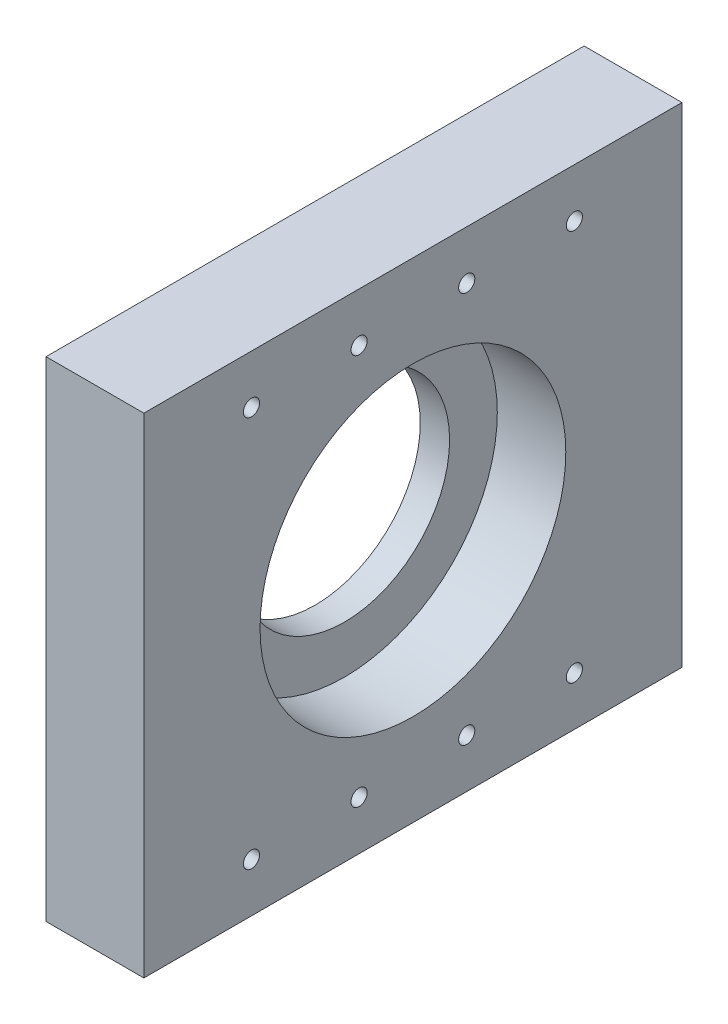
ISO-10303-21;
HEADER;
FILE_DESCRIPTION(('STEP AP214'),'2;1');
FILE_NAME('part.step','',(''),(''),'','','');
FILE_SCHEMA(('AUTOMOTIVE_DESIGN { 1 0 10303 214 1 1 1 1 }'));
ENDSEC;
DATA;
#1=APPLICATION_CONTEXT('core data for automotive mechanical design processes');
#2=APPLICATION_PROTOCOL_DEFINITION('international standard','automotive_design',2000,#1);
#3=PRODUCT_CONTEXT('',#1,'mechanical');
#4=PRODUCT('Part','Part','',(#3));
#5=PRODUCT_RELATED_PRODUCT_CATEGORY('part','',(#4));
#6=PRODUCT_DEFINITION_FORMATION('','',#4);
#7=PRODUCT_DEFINITION_CONTEXT('part definition',#1,'design');
#8=PRODUCT_DEFINITION('design','',#6,#7);
#9=PRODUCT_DEFINITION_SHAPE('','',#8);
#10=(LENGTH_UNIT() NAMED_UNIT(*) SI_UNIT(.MILLI.,.METRE.));
#11=(NAMED_UNIT(*) PLANE_ANGLE_UNIT() SI_UNIT($,.RADIAN.));
#12=(NAMED_UNIT(*) SI_UNIT($,.STERADIAN.) SOLID_ANGLE_UNIT());
#13=UNCERTAINTY_MEASURE_WITH_UNIT(LENGTH_MEASURE(1.E-05),#10,'distance_accuracy_value','');
#14=(GEOMETRIC_REPRESENTATION_CONTEXT(3) GLOBAL_UNCERTAINTY_ASSIGNED_CONTEXT((#13)) GLOBAL_UNIT_ASSIGNED_CONTEXT((#10,
#11,#12)) REPRESENTATION_CONTEXT('',''));
#15=CARTESIAN_POINT('',(0.,0.,0.));
#16=DIRECTION('',(0.,0.,1.));
#17=DIRECTION('',(1.,0.,0.));
#18=AXIS2_PLACEMENT_3D('',#15,#16,#17);
#19=CARTESIAN_POINT('',(20.,50.,-55.));
#20=DIRECTION('',(0.,0.,1.));
#21=DIRECTION('',(0.,-1.,0.));
#22=AXIS2_PLACEMENT_3D('',#19,#20,#21);
#23=PLANE('',#22);
#24=DIRECTION('',(0.,1.,0.));
#25=VECTOR('',#24,1.);
#26=CARTESIAN_POINT('',(0.,50.,-55.));
#27=LINE('',#26,#25);
#28=CARTESIAN_POINT('',(0.,-50.,-55.));
#29=VERTEX_POINT('',#28);
#30=CARTESIAN_POINT('',(0.,50.,-55.));
#31=VERTEX_POINT('',#30);
#32=EDGE_CURVE('E106',#29,#31,#27,.T.);
#33=ORIENTED_EDGE('',*,*,#32,.T.);
#34=DIRECTION('',(-1.,0.,0.));
#35=VECTOR('',#34,1.);
#36=CARTESIAN_POINT('',(20.,50.,-55.));
#37=LINE('',#36,#35);
#38=CARTESIAN_POINT('',(20.,50.,-55.));
#39=VERTEX_POINT('',#38);
#40=EDGE_CURVE('E11',#39,#31,#37,.T.);
#41=ORIENTED_EDGE('',*,*,#40,.F.);
#42=DIRECTION('',(0.,1.,0.));
#43=VECTOR('',#42,1.);
#44=CARTESIAN_POINT('',(20.,50.,-55.));
#45=LINE('',#44,#43);
#46=CARTESIAN_POINT('',(20.,-50.,-55.));
#47=VERTEX_POINT('',#46);
#48=EDGE_CURVE('E93',#47,#39,#45,.T.);
#49=ORIENTED_EDGE('',*,*,#48,.F.);
#50=DIRECTION('',(-1.,0.,0.));
#51=VECTOR('',#50,1.);
#52=CARTESIAN_POINT('',(20.,-50.,-55.));
#53=LINE('',#52,#51);
#54=EDGE_CURVE('E102',#47,#29,#53,.T.);
#55=ORIENTED_EDGE('',*,*,#54,.T.);
#56=EDGE_LOOP('',(#33,#41,#49,#55));
#57=FACE_BOUND('',#56,.T.);
#58=ADVANCED_FACE('F41',(#57),#23,.F.);
#59=CARTESIAN_POINT('',(20.,50.,55.));
#60=DIRECTION('',(0.,-1.,0.));
#61=DIRECTION('',(0.,0.,-1.));
#62=AXIS2_PLACEMENT_3D('',#59,#60,#61);
#63=PLANE('',#62);
#64=DIRECTION('',(0.,0.,1.));
#65=VECTOR('',#64,1.);
#66=CARTESIAN_POINT('',(0.,50.,55.));
#67=LINE('',#66,#65);
#68=CARTESIAN_POINT('',(0.,50.,55.));
#69=VERTEX_POINT('',#68);
#70=EDGE_CURVE('E97',#31,#69,#67,.T.);
#71=ORIENTED_EDGE('',*,*,#70,.T.);
#72=DIRECTION('',(-1.,0.,0.));
#73=VECTOR('',#72,1.);
#74=CARTESIAN_POINT('',(20.,50.,55.));
#75=LINE('',#74,#73);
#76=CARTESIAN_POINT('',(20.,50.,55.));
#77=VERTEX_POINT('',#76);
#78=EDGE_CURVE('E50',#77,#69,#75,.T.);
#79=ORIENTED_EDGE('',*,*,#78,.F.);
#80=DIRECTION('',(0.,0.,1.));
#81=VECTOR('',#80,1.);
#82=CARTESIAN_POINT('',(20.,50.,55.));
#83=LINE('',#82,#81);
#84=EDGE_CURVE('E88',#39,#77,#83,.T.);
#85=ORIENTED_EDGE('',*,*,#84,.F.);
#86=ORIENTED_EDGE('',*,*,#40,.T.);
#87=EDGE_LOOP('',(#71,#79,#85,#86));
#88=FACE_BOUND('',#87,.T.);
#89=ADVANCED_FACE('F96',(#88),#63,.F.);
#90=CARTESIAN_POINT('',(20.,50.,55.));
#91=DIRECTION('',(0.,0.,-1.));
#92=DIRECTION('',(0.,1.,0.));
#93=AXIS2_PLACEMENT_3D('',#90,#91,#92);
#94=PLANE('',#93);
#95=DIRECTION('',(0.,-1.,0.));
#96=VECTOR('',#95,1.);
#97=CARTESIAN_POINT('',(0.,50.,55.));
#98=LINE('',#97,#96);
#99=CARTESIAN_POINT('',(0.,-50.,55.));
#100=VERTEX_POINT('',#99);
#101=EDGE_CURVE('E75',#69,#100,#98,.T.);
#102=ORIENTED_EDGE('',*,*,#101,.T.);
#103=DIRECTION('',(-1.,0.,0.));
#104=VECTOR('',#103,1.);
#105=CARTESIAN_POINT('',(20.,-50.,55.));
#106=LINE('',#105,#104);
#107=CARTESIAN_POINT('',(20.,-50.,55.));
#108=VERTEX_POINT('',#107);
#109=EDGE_CURVE('E98',#108,#100,#106,.T.);
#110=ORIENTED_EDGE('',*,*,#109,.F.);
#111=DIRECTION('',(0.,-1.,0.));
#112=VECTOR('',#111,1.);
#113=CARTESIAN_POINT('',(20.,50.,55.));
#114=LINE('',#113,#112);
#115=EDGE_CURVE('E91',#77,#108,#114,.T.);
#116=ORIENTED_EDGE('',*,*,#115,.F.);
#117=ORIENTED_EDGE('',*,*,#78,.T.);
#118=EDGE_LOOP('',(#102,#110,#116,#117));
#119=FACE_BOUND('',#118,.T.);
#120=ADVANCED_FACE('F100',(#119),#94,.F.);
#121=CARTESIAN_POINT('',(20.,-50.,55.));
#122=DIRECTION('',(0.,1.,0.));
#123=DIRECTION('',(0.,0.,1.));
#124=AXIS2_PLACEMENT_3D('',#121,#122,#123);
#125=PLANE('',#124);
#126=DIRECTION('',(0.,0.,-1.));
#127=VECTOR('',#126,1.);
#128=CARTESIAN_POINT('',(0.,-50.,55.));
#129=LINE('',#128,#127);
#130=EDGE_CURVE('E81',#100,#29,#129,.T.);
#131=ORIENTED_EDGE('',*,*,#130,.T.);
#132=ORIENTED_EDGE('',*,*,#54,.F.);
#133=DIRECTION('',(0.,0.,-1.));
#134=VECTOR('',#133,1.);
#135=CARTESIAN_POINT('',(20.,-50.,55.));
#136=LINE('',#135,#134);
#137=EDGE_CURVE('E58',#108,#47,#136,.T.);
#138=ORIENTED_EDGE('',*,*,#137,.F.);
#139=ORIENTED_EDGE('',*,*,#109,.T.);
#140=EDGE_LOOP('',(#131,#132,#138,#139));
#141=FACE_BOUND('',#140,.T.);
#142=ADVANCED_FACE('F114',(#141),#125,.F.);
#143=CARTESIAN_POINT('',(20.,0.,0.));
#144=DIRECTION('',(1.,0.,0.));
#145=DIRECTION('',(0.,0.,-1.));
#146=AXIS2_PLACEMENT_3D('',#143,#144,#145);
#147=PLANE('',#146);
#148=CARTESIAN_POINT('',(20.,-40.,11.));
#149=DIRECTION('',(1.,0.,0.));
#150=DIRECTION('',(0.,0.,1.));
#151=AXIS2_PLACEMENT_3D('',#148,#149,#150);
#152=CIRCLE('',#151,1.65);
#153=CARTESIAN_POINT('',(20.,-40.,12.65));
#154=VERTEX_POINT('',#153);
#155=EDGE_CURVE('E150',#154,#154,#152,.T.);
#156=ORIENTED_EDGE('',*,*,#155,.F.);
#157=EDGE_LOOP('',(#156));
#158=FACE_BOUND('',#157,.T.);
#159=CARTESIAN_POINT('',(20.,40.,33.));
#160=DIRECTION('',(1.,0.,0.));
#161=DIRECTION('',(0.,0.,-1.));
#162=AXIS2_PLACEMENT_3D('',#159,#160,#161);
#163=CIRCLE('',#162,1.65);
#164=CARTESIAN_POINT('',(20.,40.,31.35));
#165=VERTEX_POINT('',#164);
#166=EDGE_CURVE('E139',#165,#165,#163,.T.);
#167=ORIENTED_EDGE('',*,*,#166,.F.);
#168=EDGE_LOOP('',(#167));
#169=FACE_BOUND('',#168,.T.);
#170=CARTESIAN_POINT('',(20.,40.,11.));
#171=DIRECTION('',(1.,0.,0.));
#172=DIRECTION('',(0.,0.,-1.));
#173=AXIS2_PLACEMENT_3D('',#170,#171,#172);
#174=CIRCLE('',#173,1.65);
#175=CARTESIAN_POINT('',(20.,40.,9.34999999999997));
#176=VERTEX_POINT('',#175);
#177=EDGE_CURVE('E138',#176,#176,#174,.T.);
#178=ORIENTED_EDGE('',*,*,#177,.F.);
#179=EDGE_LOOP('',(#178));
#180=FACE_BOUND('',#179,.T.);
#181=CARTESIAN_POINT('',(20.,40.,-11.));
#182=DIRECTION('',(1.,0.,0.));
#183=DIRECTION('',(0.,0.,-1.));
#184=AXIS2_PLACEMENT_3D('',#181,#182,#183);
#185=CIRCLE('',#184,1.65);
#186=CARTESIAN_POINT('',(20.,40.,-12.65));
#187=VERTEX_POINT('',#186);
#188=EDGE_CURVE('E132',#187,#187,#185,.T.);
#189=ORIENTED_EDGE('',*,*,#188,.F.);
#190=EDGE_LOOP('',(#189));
#191=FACE_BOUND('',#190,.T.);
#192=CARTESIAN_POINT('',(20.,-40.,-11.));
#193=DIRECTION('',(1.,0.,0.));
#194=DIRECTION('',(0.,0.,1.));
#195=AXIS2_PLACEMENT_3D('',#192,#193,#194);
#196=CIRCLE('',#195,1.65);
#197=CARTESIAN_POINT('',(20.,-40.,-9.35000000000002));
#198=VERTEX_POINT('',#197);
#199=EDGE_CURVE('E151',#198,#198,#196,.T.);
#200=ORIENTED_EDGE('',*,*,#199,.F.);
#201=EDGE_LOOP('',(#200));
#202=FACE_BOUND('',#201,.T.);
#203=CARTESIAN_POINT('',(20.,-40.,-33.));
#204=DIRECTION('',(1.,0.,0.));
#205=DIRECTION('',(0.,0.,1.));
#206=AXIS2_PLACEMENT_3D('',#203,#204,#205);
#207=CIRCLE('',#206,1.65);
#208=CARTESIAN_POINT('',(20.,-40.,-31.35));
#209=VERTEX_POINT('',#208);
#210=EDGE_CURVE('E168',#209,#209,#207,.T.);
#211=ORIENTED_EDGE('',*,*,#210,.F.);
#212=EDGE_LOOP('',(#211));
#213=FACE_BOUND('',#212,.T.);
#214=CARTESIAN_POINT('',(20.,-40.,33.));
#215=DIRECTION('',(1.,0.,0.));
#216=DIRECTION('',(0.,0.,1.));
#217=AXIS2_PLACEMENT_3D('',#214,#215,#216);
#218=CIRCLE('',#217,1.65);
#219=CARTESIAN_POINT('',(20.,-40.,34.65));
#220=VERTEX_POINT('',#219);
#221=EDGE_CURVE('E162',#220,#220,#218,.T.);
#222=ORIENTED_EDGE('',*,*,#221,.F.);
#223=EDGE_LOOP('',(#222));
#224=FACE_BOUND('',#223,.T.);
#225=CARTESIAN_POINT('',(20.,40.,-33.));
#226=DIRECTION('',(1.,0.,0.));
#227=DIRECTION('',(0.,0.,-1.));
#228=AXIS2_PLACEMENT_3D('',#225,#226,#227);
#229=CIRCLE('',#228,1.65);
#230=CARTESIAN_POINT('',(20.,40.,-34.65));
#231=VERTEX_POINT('',#230);
#232=EDGE_CURVE('E129',#231,#231,#229,.T.);
#233=ORIENTED_EDGE('',*,*,#232,.F.);
#234=EDGE_LOOP('',(#233));
#235=FACE_BOUND('',#234,.T.);
#236=CARTESIAN_POINT('',(20.,0.,0.));
#237=DIRECTION('',(1.,0.,0.));
#238=DIRECTION('',(0.,0.,-1.));
#239=AXIS2_PLACEMENT_3D('',#236,#237,#238);
#240=CIRCLE('',#239,31.25);
#241=CARTESIAN_POINT('',(20.,0.,-31.25));
#242=VERTEX_POINT('',#241);
#243=EDGE_CURVE('E120',#242,#242,#240,.T.);
#244=ORIENTED_EDGE('',*,*,#243,.F.);
#245=EDGE_LOOP('',(#244));
#246=FACE_BOUND('',#245,.T.);
#247=ORIENTED_EDGE('',*,*,#48,.T.);
#248=ORIENTED_EDGE('',*,*,#84,.T.);
#249=ORIENTED_EDGE('',*,*,#115,.T.);
#250=ORIENTED_EDGE('',*,*,#137,.T.);
#251=EDGE_LOOP('',(#247,#248,#249,#250));
#252=FACE_BOUND('',#251,.T.);
#253=ADVANCED_FACE('F89',(#158,#169,#180,#191,#202,#213,#224,#235,#246,#252),#147,.T.);
#254=CARTESIAN_POINT('',(0.,0.,0.));
#255=DIRECTION('',(1.,0.,0.));
#256=DIRECTION('',(0.,0.,-1.));
#257=AXIS2_PLACEMENT_3D('',#254,#255,#256);
#258=PLANE('',#257);
#259=CARTESIAN_POINT('',(0.,-40.,11.));
#260=DIRECTION('',(1.,0.,0.));
#261=DIRECTION('',(0.,0.,1.));
#262=AXIS2_PLACEMENT_3D('',#259,#260,#261);
#263=CIRCLE('',#262,1.65);
#264=CARTESIAN_POINT('',(0.,-40.,12.65));
#265=VERTEX_POINT('',#264);
#266=EDGE_CURVE('E147',#265,#265,#263,.T.);
#267=ORIENTED_EDGE('',*,*,#266,.T.);
#268=EDGE_LOOP('',(#267));
#269=FACE_BOUND('',#268,.T.);
#270=CARTESIAN_POINT('',(0.,40.,33.));
#271=DIRECTION('',(1.,0.,0.));
#272=DIRECTION('',(0.,0.,-1.));
#273=AXIS2_PLACEMENT_3D('',#270,#271,#272);
#274=CIRCLE('',#273,1.65);
#275=CARTESIAN_POINT('',(0.,40.,31.35));
#276=VERTEX_POINT('',#275);
#277=EDGE_CURVE('E154',#276,#276,#274,.T.);
#278=ORIENTED_EDGE('',*,*,#277,.T.);
#279=EDGE_LOOP('',(#278));
#280=FACE_BOUND('',#279,.T.);
#281=CARTESIAN_POINT('',(0.,40.,11.));
#282=DIRECTION('',(1.,0.,0.));
#283=DIRECTION('',(0.,0.,-1.));
#284=AXIS2_PLACEMENT_3D('',#281,#282,#283);
#285=CIRCLE('',#284,1.65);
#286=CARTESIAN_POINT('',(0.,40.,9.34999999999997));
#287=VERTEX_POINT('',#286);
#288=EDGE_CURVE('E135',#287,#287,#285,.T.);
#289=ORIENTED_EDGE('',*,*,#288,.T.);
#290=EDGE_LOOP('',(#289));
#291=FACE_BOUND('',#290,.T.);
#292=CARTESIAN_POINT('',(0.,40.,-11.));
#293=DIRECTION('',(1.,0.,0.));
#294=DIRECTION('',(0.,0.,-1.));
#295=AXIS2_PLACEMENT_3D('',#292,#293,#294);
#296=CIRCLE('',#295,1.65);
#297=CARTESIAN_POINT('',(0.,40.,-12.65));
#298=VERTEX_POINT('',#297);
#299=EDGE_CURVE('E142',#298,#298,#296,.T.);
#300=ORIENTED_EDGE('',*,*,#299,.T.);
#301=EDGE_LOOP('',(#300));
#302=FACE_BOUND('',#301,.T.);
#303=CARTESIAN_POINT('',(0.,-40.,-11.));
#304=DIRECTION('',(1.,0.,0.));
#305=DIRECTION('',(0.,0.,1.));
#306=AXIS2_PLACEMENT_3D('',#303,#304,#305);
#307=CIRCLE('',#306,1.65);
#308=CARTESIAN_POINT('',(0.,-40.,-9.35000000000002));
#309=VERTEX_POINT('',#308);
#310=EDGE_CURVE('E171',#309,#309,#307,.T.);
#311=ORIENTED_EDGE('',*,*,#310,.T.);
#312=EDGE_LOOP('',(#311));
#313=FACE_BOUND('',#312,.T.);
#314=CARTESIAN_POINT('',(0.,-40.,-33.));
#315=DIRECTION('',(1.,0.,0.));
#316=DIRECTION('',(0.,0.,1.));
#317=AXIS2_PLACEMENT_3D('',#314,#315,#316);
#318=CIRCLE('',#317,1.65);
#319=CARTESIAN_POINT('',(0.,-40.,-31.35));
#320=VERTEX_POINT('',#319);
#321=EDGE_CURVE('E165',#320,#320,#318,.T.);
#322=ORIENTED_EDGE('',*,*,#321,.T.);
#323=EDGE_LOOP('',(#322));
#324=FACE_BOUND('',#323,.T.);
#325=CARTESIAN_POINT('',(0.,-40.,33.));
#326=DIRECTION('',(1.,0.,0.));
#327=DIRECTION('',(0.,0.,1.));
#328=AXIS2_PLACEMENT_3D('',#325,#326,#327);
#329=CIRCLE('',#328,1.65);
#330=CARTESIAN_POINT('',(0.,-40.,34.65));
#331=VERTEX_POINT('',#330);
#332=EDGE_CURVE('E159',#331,#331,#329,.T.);
#333=ORIENTED_EDGE('',*,*,#332,.T.);
#334=EDGE_LOOP('',(#333));
#335=FACE_BOUND('',#334,.T.);
#336=CARTESIAN_POINT('',(0.,40.,-33.));
#337=DIRECTION('',(1.,0.,0.));
#338=DIRECTION('',(0.,0.,-1.));
#339=AXIS2_PLACEMENT_3D('',#336,#337,#338);
#340=CIRCLE('',#339,1.65);
#341=CARTESIAN_POINT('',(0.,40.,-34.65));
#342=VERTEX_POINT('',#341);
#343=EDGE_CURVE('E128',#342,#342,#340,.T.);
#344=ORIENTED_EDGE('',*,*,#343,.T.);
#345=EDGE_LOOP('',(#344));
#346=FACE_BOUND('',#345,.T.);
#347=CARTESIAN_POINT('',(0.,0.,0.));
#348=DIRECTION('',(1.,0.,0.));
#349=DIRECTION('',(0.,0.,-1.));
#350=AXIS2_PLACEMENT_3D('',#347,#348,#349);
#351=CIRCLE('',#350,21.5);
#352=CARTESIAN_POINT('',(0.,0.,-21.5));
#353=VERTEX_POINT('',#352);
#354=EDGE_CURVE('E44',#353,#353,#351,.T.);
#355=ORIENTED_EDGE('',*,*,#354,.T.);
#356=EDGE_LOOP('',(#355));
#357=FACE_BOUND('',#356,.T.);
#358=ORIENTED_EDGE('',*,*,#32,.F.);
#359=ORIENTED_EDGE('',*,*,#130,.F.);
#360=ORIENTED_EDGE('',*,*,#101,.F.);
#361=ORIENTED_EDGE('',*,*,#70,.F.);
#362=EDGE_LOOP('',(#358,#359,#360,#361));
#363=FACE_BOUND('',#362,.T.);
#364=ADVANCED_FACE('F117',(#269,#280,#291,#302,#313,#324,#335,#346,#357,#363),#258,.F.);
#365=CARTESIAN_POINT('',(6.,0.,0.));
#366=DIRECTION('',(1.,0.,0.));
#367=DIRECTION('',(0.,0.,-1.));
#368=AXIS2_PLACEMENT_3D('',#365,#366,#367);
#369=CYLINDRICAL_SURFACE('',#368,31.25);
#370=CARTESIAN_POINT('',(6.,0.,0.));
#371=DIRECTION('',(1.,0.,0.));
#372=DIRECTION('',(0.,0.,-1.));
#373=AXIS2_PLACEMENT_3D('',#370,#371,#372);
#374=CIRCLE('',#373,31.25);
#375=CARTESIAN_POINT('',(6.,0.,-31.25));
#376=VERTEX_POINT('',#375);
#377=EDGE_CURVE('E109',#376,#376,#374,.T.);
#378=ORIENTED_EDGE('',*,*,#377,.F.);
#379=EDGE_LOOP('',(#378));
#380=FACE_BOUND('',#379,.T.);
#381=ORIENTED_EDGE('',*,*,#243,.T.);
#382=EDGE_LOOP('',(#381));
#383=FACE_BOUND('',#382,.T.);
#384=ADVANCED_FACE('F191',(#380,#383),#369,.F.);
#385=CARTESIAN_POINT('',(6.,0.,0.));
#386=DIRECTION('',(1.,0.,0.));
#387=DIRECTION('',(0.,0.,-1.));
#388=AXIS2_PLACEMENT_3D('',#385,#386,#387);
#389=PLANE('',#388);
#390=CARTESIAN_POINT('',(6.,0.,0.));
#391=DIRECTION('',(1.,0.,0.));
#392=DIRECTION('',(0.,0.,-1.));
#393=AXIS2_PLACEMENT_3D('',#390,#391,#392);
#394=CIRCLE('',#393,21.5);
#395=CARTESIAN_POINT('',(6.,0.,-21.5));
#396=VERTEX_POINT('',#395);
#397=EDGE_CURVE('E125',#396,#396,#394,.T.);
#398=ORIENTED_EDGE('',*,*,#397,.F.);
#399=EDGE_LOOP('',(#398));
#400=FACE_BOUND('',#399,.T.);
#401=ORIENTED_EDGE('',*,*,#377,.T.);
#402=EDGE_LOOP('',(#401));
#403=FACE_BOUND('',#402,.T.);
#404=ADVANCED_FACE('F193',(#400,#403),#389,.T.);
#405=CARTESIAN_POINT('',(-8.,0.,0.));
#406=DIRECTION('',(1.,0.,0.));
#407=DIRECTION('',(0.,0.,-1.));
#408=AXIS2_PLACEMENT_3D('',#405,#406,#407);
#409=CYLINDRICAL_SURFACE('',#408,21.5);
#410=ORIENTED_EDGE('',*,*,#397,.T.);
#411=EDGE_LOOP('',(#410));
#412=FACE_BOUND('',#411,.T.);
#413=ORIENTED_EDGE('',*,*,#354,.F.);
#414=EDGE_LOOP('',(#413));
#415=FACE_BOUND('',#414,.T.);
#416=ADVANCED_FACE('F200',(#412,#415),#409,.F.);
#417=CARTESIAN_POINT('',(0.,40.,-33.));
#418=DIRECTION('',(1.,0.,0.));
#419=DIRECTION('',(0.,0.,-1.));
#420=AXIS2_PLACEMENT_3D('',#417,#418,#419);
#421=CYLINDRICAL_SURFACE('',#420,1.65);
#422=ORIENTED_EDGE('',*,*,#343,.F.);
#423=EDGE_LOOP('',(#422));
#424=FACE_BOUND('',#423,.T.);
#425=ORIENTED_EDGE('',*,*,#232,.T.);
#426=EDGE_LOOP('',(#425));
#427=FACE_BOUND('',#426,.T.);
#428=ADVANCED_FACE('F260',(#424,#427),#421,.F.);
#429=CARTESIAN_POINT('',(0.,-40.,33.));
#430=DIRECTION('',(1.,0.,0.));
#431=DIRECTION('',(0.,0.,-1.));
#432=AXIS2_PLACEMENT_3D('',#429,#430,#431);
#433=CYLINDRICAL_SURFACE('',#432,1.65);
#434=ORIENTED_EDGE('',*,*,#332,.F.);
#435=EDGE_LOOP('',(#434));
#436=FACE_BOUND('',#435,.T.);
#437=ORIENTED_EDGE('',*,*,#221,.T.);
#438=EDGE_LOOP('',(#437));
#439=FACE_BOUND('',#438,.T.);
#440=ADVANCED_FACE('F269',(#436,#439),#433,.F.);
#441=CARTESIAN_POINT('',(0.,-40.,-33.));
#442=DIRECTION('',(1.,0.,0.));
#443=DIRECTION('',(0.,0.,-1.));
#444=AXIS2_PLACEMENT_3D('',#441,#442,#443);
#445=CYLINDRICAL_SURFACE('',#444,1.65);
#446=ORIENTED_EDGE('',*,*,#321,.F.);
#447=EDGE_LOOP('',(#446));
#448=FACE_BOUND('',#447,.T.);
#449=ORIENTED_EDGE('',*,*,#210,.T.);
#450=EDGE_LOOP('',(#449));
#451=FACE_BOUND('',#450,.T.);
#452=ADVANCED_FACE('F278',(#448,#451),#445,.F.);
#453=CARTESIAN_POINT('',(0.,-40.,-11.));
#454=DIRECTION('',(1.,0.,0.));
#455=DIRECTION('',(0.,0.,-1.));
#456=AXIS2_PLACEMENT_3D('',#453,#454,#455);
#457=CYLINDRICAL_SURFACE('',#456,1.65);
#458=ORIENTED_EDGE('',*,*,#310,.F.);
#459=EDGE_LOOP('',(#458));
#460=FACE_BOUND('',#459,.T.);
#461=ORIENTED_EDGE('',*,*,#199,.T.);
#462=EDGE_LOOP('',(#461));
#463=FACE_BOUND('',#462,.T.);
#464=ADVANCED_FACE('F177',(#460,#463),#457,.F.);
#465=CARTESIAN_POINT('',(0.,40.,-11.));
#466=DIRECTION('',(1.,0.,0.));
#467=DIRECTION('',(0.,0.,-1.));
#468=AXIS2_PLACEMENT_3D('',#465,#466,#467);
#469=CYLINDRICAL_SURFACE('',#468,1.65);
#470=ORIENTED_EDGE('',*,*,#299,.F.);
#471=EDGE_LOOP('',(#470));
#472=FACE_BOUND('',#471,.T.);
#473=ORIENTED_EDGE('',*,*,#188,.T.);
#474=EDGE_LOOP('',(#473));
#475=FACE_BOUND('',#474,.T.);
#476=ADVANCED_FACE('F295',(#472,#475),#469,.F.);
#477=CARTESIAN_POINT('',(0.,40.,11.));
#478=DIRECTION('',(1.,0.,0.));
#479=DIRECTION('',(0.,0.,-1.));
#480=AXIS2_PLACEMENT_3D('',#477,#478,#479);
#481=CYLINDRICAL_SURFACE('',#480,1.65);
#482=ORIENTED_EDGE('',*,*,#288,.F.);
#483=EDGE_LOOP('',(#482));
#484=FACE_BOUND('',#483,.T.);
#485=ORIENTED_EDGE('',*,*,#177,.T.);
#486=EDGE_LOOP('',(#485));
#487=FACE_BOUND('',#486,.T.);
#488=ADVANCED_FACE('F304',(#484,#487),#481,.F.);
#489=CARTESIAN_POINT('',(0.,40.,33.));
#490=DIRECTION('',(1.,0.,0.));
#491=DIRECTION('',(0.,0.,-1.));
#492=AXIS2_PLACEMENT_3D('',#489,#490,#491);
#493=CYLINDRICAL_SURFACE('',#492,1.65);
#494=ORIENTED_EDGE('',*,*,#277,.F.);
#495=EDGE_LOOP('',(#494));
#496=FACE_BOUND('',#495,.T.);
#497=ORIENTED_EDGE('',*,*,#166,.T.);
#498=EDGE_LOOP('',(#497));
#499=FACE_BOUND('',#498,.T.);
#500=ADVANCED_FACE('F313',(#496,#499),#493,.F.);
#501=CARTESIAN_POINT('',(0.,-40.,11.));
#502=DIRECTION('',(1.,0.,0.));
#503=DIRECTION('',(0.,0.,-1.));
#504=AXIS2_PLACEMENT_3D('',#501,#502,#503);
#505=CYLINDRICAL_SURFACE('',#504,1.65);
#506=ORIENTED_EDGE('',*,*,#266,.F.);
#507=EDGE_LOOP('',(#506));
#508=FACE_BOUND('',#507,.T.);
#509=ORIENTED_EDGE('',*,*,#155,.T.);
#510=EDGE_LOOP('',(#509));
#511=FACE_BOUND('',#510,.T.);
#512=ADVANCED_FACE('F322',(#508,#511),#505,.F.);
#513=CLOSED_SHELL('',(#58,#89,#120,#142,#253,#364,#384,#404,#416,#428,#440,#452,#464,#476,#488,
#500,#512));
#514=MANIFOLD_SOLID_BREP('B2',#513);
#515=ADVANCED_BREP_SHAPE_REPRESENTATION('',(#18,#514),#14);
#516=SHAPE_DEFINITION_REPRESENTATION(#9,#515);
ENDSEC;
END-ISO-10303-21;
